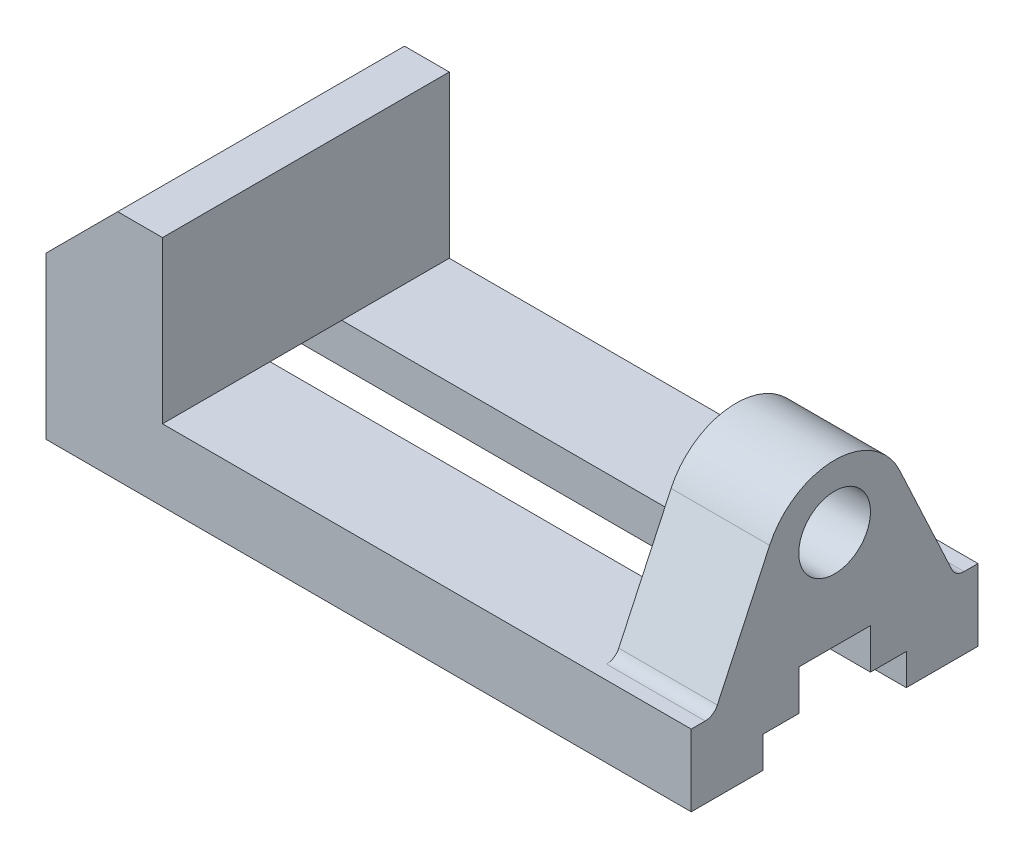
ISO-10303-21;
HEADER;
FILE_DESCRIPTION(('STEP AP214'),'2;1');
FILE_NAME('part.step','',(''),(''),'','','');
FILE_SCHEMA(('AUTOMOTIVE_DESIGN { 1 0 10303 214 1 1 1 1 }'));
ENDSEC;
DATA;
#1=APPLICATION_CONTEXT('core data for automotive mechanical design processes');
#2=APPLICATION_PROTOCOL_DEFINITION('international standard','automotive_design',2000,#1);
#3=PRODUCT_CONTEXT('',#1,'mechanical');
#4=PRODUCT('Part','Part','',(#3));
#5=PRODUCT_RELATED_PRODUCT_CATEGORY('part','',(#4));
#6=PRODUCT_DEFINITION_FORMATION('','',#4);
#7=PRODUCT_DEFINITION_CONTEXT('part definition',#1,'design');
#8=PRODUCT_DEFINITION('design','',#6,#7);
#9=PRODUCT_DEFINITION_SHAPE('','',#8);
#10=(LENGTH_UNIT() NAMED_UNIT(*) SI_UNIT(.MILLI.,.METRE.));
#11=(NAMED_UNIT(*) PLANE_ANGLE_UNIT() SI_UNIT($,.RADIAN.));
#12=(NAMED_UNIT(*) SI_UNIT($,.STERADIAN.) SOLID_ANGLE_UNIT());
#13=UNCERTAINTY_MEASURE_WITH_UNIT(LENGTH_MEASURE(1.E-05),#10,'distance_accuracy_value','');
#14=(GEOMETRIC_REPRESENTATION_CONTEXT(3) GLOBAL_UNCERTAINTY_ASSIGNED_CONTEXT((#13)) GLOBAL_UNIT_ASSIGNED_CONTEXT((#10,
#11,#12)) REPRESENTATION_CONTEXT('',''));
#15=CARTESIAN_POINT('',(0.,0.,0.));
#16=DIRECTION('',(0.,0.,1.));
#17=DIRECTION('',(1.,0.,0.));
#18=AXIS2_PLACEMENT_3D('',#15,#16,#17);
#19=CARTESIAN_POINT('',(144.,16.,64.));
#20=DIRECTION('',(-1.,0.,0.));
#21=DIRECTION('',(0.,0.,1.));
#22=AXIS2_PLACEMENT_3D('',#19,#20,#21);
#23=PLANE('',#22);
#24=CARTESIAN_POINT('',(144.,38.,32.));
#25=DIRECTION('',(1.,0.,0.));
#26=DIRECTION('',(0.,0.,-1.));
#27=AXIS2_PLACEMENT_3D('',#24,#25,#26);
#28=CIRCLE('',#27,8.);
#29=CARTESIAN_POINT('',(144.,38.,24.));
#30=VERTEX_POINT('',#29);
#31=EDGE_CURVE('E390',#30,#30,#28,.T.);
#32=ORIENTED_EDGE('',*,*,#31,.F.);
#33=EDGE_LOOP('',(#32));
#34=FACE_BOUND('',#33,.T.);
#35=DIRECTION('',(0.,1.,0.));
#36=VECTOR('',#35,1.);
#37=CARTESIAN_POINT('',(144.,0.,48.));
#38=LINE('',#37,#36);
#39=CARTESIAN_POINT('',(144.,0.,48.));
#40=VERTEX_POINT('',#39);
#41=CARTESIAN_POINT('',(144.,7.,48.));
#42=VERTEX_POINT('',#41);
#43=EDGE_CURVE('E291',#40,#42,#38,.T.);
#44=ORIENTED_EDGE('',*,*,#43,.T.);
#45=DIRECTION('',(0.,0.,-1.));
#46=VECTOR('',#45,1.);
#47=CARTESIAN_POINT('',(144.,7.,0.));
#48=LINE('',#47,#46);
#49=CARTESIAN_POINT('',(144.,7.,40.));
#50=VERTEX_POINT('',#49);
#51=EDGE_CURVE('E319',#42,#50,#48,.T.);
#52=ORIENTED_EDGE('',*,*,#51,.T.);
#53=DIRECTION('',(0.,1.,0.));
#54=VECTOR('',#53,1.);
#55=CARTESIAN_POINT('',(144.,0.,40.));
#56=LINE('',#55,#54);
#57=CARTESIAN_POINT('',(144.,16.,40.));
#58=VERTEX_POINT('',#57);
#59=EDGE_CURVE('E316',#50,#58,#56,.T.);
#60=ORIENTED_EDGE('',*,*,#59,.T.);
#61=DIRECTION('',(0.,0.,-1.));
#62=VECTOR('',#61,1.);
#63=CARTESIAN_POINT('',(144.,16.,0.));
#64=LINE('',#63,#62);
#65=CARTESIAN_POINT('',(144.,16.,24.));
#66=VERTEX_POINT('',#65);
#67=EDGE_CURVE('E313',#58,#66,#64,.T.);
#68=ORIENTED_EDGE('',*,*,#67,.T.);
#69=DIRECTION('',(0.,1.,0.));
#70=VECTOR('',#69,1.);
#71=CARTESIAN_POINT('',(144.,0.,24.));
#72=LINE('',#71,#70);
#73=CARTESIAN_POINT('',(144.,7.,24.));
#74=VERTEX_POINT('',#73);
#75=EDGE_CURVE('E310',#74,#66,#72,.T.);
#76=ORIENTED_EDGE('',*,*,#75,.F.);
#77=DIRECTION('',(0.,0.,1.));
#78=VECTOR('',#77,1.);
#79=CARTESIAN_POINT('',(144.,7.,0.));
#80=LINE('',#79,#78);
#81=CARTESIAN_POINT('',(144.,7.,16.));
#82=VERTEX_POINT('',#81);
#83=EDGE_CURVE('E307',#82,#74,#80,.T.);
#84=ORIENTED_EDGE('',*,*,#83,.F.);
#85=DIRECTION('',(0.,1.,0.));
#86=VECTOR('',#85,1.);
#87=CARTESIAN_POINT('',(144.,0.,16.));
#88=LINE('',#87,#86);
#89=CARTESIAN_POINT('',(144.,0.,16.));
#90=VERTEX_POINT('',#89);
#91=EDGE_CURVE('E287',#90,#82,#88,.T.);
#92=ORIENTED_EDGE('',*,*,#91,.F.);
#93=DIRECTION('',(0.,0.,-1.));
#94=VECTOR('',#93,1.);
#95=CARTESIAN_POINT('',(144.,0.,64.));
#96=LINE('',#95,#94);
#97=CARTESIAN_POINT('',(144.,0.,0.));
#98=VERTEX_POINT('',#97);
#99=EDGE_CURVE('E450',#90,#98,#96,.T.);
#100=ORIENTED_EDGE('',*,*,#99,.T.);
#101=DIRECTION('',(0.,1.,0.));
#102=VECTOR('',#101,1.);
#103=CARTESIAN_POINT('',(144.,16.,0.));
#104=LINE('',#103,#102);
#105=CARTESIAN_POINT('',(144.,16.,0.));
#106=VERTEX_POINT('',#105);
#107=EDGE_CURVE('E421',#98,#106,#104,.T.);
#108=ORIENTED_EDGE('',*,*,#107,.T.);
#109=DIRECTION('',(0.,0.,1.));
#110=VECTOR('',#109,1.);
#111=CARTESIAN_POINT('',(144.,16.,0.));
#112=LINE('',#111,#110);
#113=CARTESIAN_POINT('',(144.,16.,3.10858935107766));
#114=VERTEX_POINT('',#113);
#115=EDGE_CURVE('E384',#106,#114,#112,.T.);
#116=ORIENTED_EDGE('',*,*,#115,.T.);
#117=CARTESIAN_POINT('',(144.,19.,3.10858935107766));
#118=DIRECTION('',(1.,0.,0.));
#119=DIRECTION('',(0.,0.,-1.));
#120=AXIS2_PLACEMENT_3D('',#117,#118,#119);
#121=CIRCLE('',#120,3.);
#122=CARTESIAN_POINT('',(144.,17.7321452147779,5.82751271218761));
#123=VERTEX_POINT('',#122);
#124=EDGE_CURVE('E381',#123,#114,#121,.T.);
#125=ORIENTED_EDGE('',*,*,#124,.F.);
#126=DIRECTION('',(0.,-0.90630778703665,-0.4226182617407));
#127=VECTOR('',#126,1.);
#128=CARTESIAN_POINT('',(144.,0.935004123589847,-2.0051228137434));
#129=LINE('',#128,#127);
#130=CARTESIAN_POINT('',(144.,42.7618921878512,17.4990754074136));
#131=VERTEX_POINT('',#130);
#132=EDGE_CURVE('E364',#131,#123,#129,.T.);
#133=ORIENTED_EDGE('',*,*,#132,.F.);
#134=CARTESIAN_POINT('',(144.,36.,32.));
#135=DIRECTION('',(1.,0.,0.));
#136=DIRECTION('',(0.,0.,-1.));
#137=AXIS2_PLACEMENT_3D('',#134,#135,#136);
#138=CIRCLE('',#137,16.);
#139=CARTESIAN_POINT('',(144.,42.7618921878512,46.5009245925864));
#140=VERTEX_POINT('',#139);
#141=EDGE_CURVE('E373',#131,#140,#138,.T.);
#142=ORIENTED_EDGE('',*,*,#141,.T.);
#143=DIRECTION('',(0.,-0.90630778703665,0.4226182617407));
#144=VECTOR('',#143,1.);
#145=CARTESIAN_POINT('',(144.,25.4484263033972,54.5743263237126));
#146=LINE('',#145,#144);
#147=CARTESIAN_POINT('',(144.,17.7321452147779,58.1724872878124));
#148=VERTEX_POINT('',#147);
#149=EDGE_CURVE('E357',#140,#148,#146,.T.);
#150=ORIENTED_EDGE('',*,*,#149,.T.);
#151=CARTESIAN_POINT('',(144.,19.,60.8914106489223));
#152=DIRECTION('',(1.,0.,0.));
#153=DIRECTION('',(0.,0.,-1.));
#154=AXIS2_PLACEMENT_3D('',#151,#152,#153);
#155=CIRCLE('',#154,3.);
#156=CARTESIAN_POINT('',(144.,16.,60.8914106489224));
#157=VERTEX_POINT('',#156);
#158=EDGE_CURVE('E348',#148,#157,#155,.F.);
#159=ORIENTED_EDGE('',*,*,#158,.T.);
#160=DIRECTION('',(0.,0.,-1.));
#161=VECTOR('',#160,1.);
#162=CARTESIAN_POINT('',(144.,16.0000000000001,0.));
#163=LINE('',#162,#161);
#164=CARTESIAN_POINT('',(144.,16.,64.));
#165=VERTEX_POINT('',#164);
#166=EDGE_CURVE('E352',#165,#157,#163,.T.);
#167=ORIENTED_EDGE('',*,*,#166,.F.);
#168=DIRECTION('',(0.,1.,0.));
#169=VECTOR('',#168,1.);
#170=CARTESIAN_POINT('',(144.,0.,64.));
#171=LINE('',#170,#169);
#172=CARTESIAN_POINT('',(144.,0.,64.));
#173=VERTEX_POINT('',#172);
#174=EDGE_CURVE('E406',#173,#165,#171,.T.);
#175=ORIENTED_EDGE('',*,*,#174,.F.);
#176=EDGE_CURVE('E451',#173,#40,#96,.T.);
#177=ORIENTED_EDGE('',*,*,#176,.T.);
#178=EDGE_LOOP('',(#44,#52,#60,#68,#76,#84,#92,#100,#108,#116,#125,#133,#142,#150,#159,#167,
#175,#177));
#179=FACE_BOUND('',#178,.T.);
#180=ADVANCED_FACE('F78',(#34,#179),#23,.F.);
#181=CARTESIAN_POINT('',(0.,0.,64.));
#182=DIRECTION('',(0.,1.,0.));
#183=DIRECTION('',(0.,0.,1.));
#184=AXIS2_PLACEMENT_3D('',#181,#182,#183);
#185=PLANE('',#184);
#186=CARTESIAN_POINT('',(36.,0.,54.));
#187=DIRECTION('',(0.,-1.,0.));
#188=DIRECTION('',(0.,0.,-1.));
#189=AXIS2_PLACEMENT_3D('',#186,#187,#188);
#190=CIRCLE('',#189,2.525);
#191=CARTESIAN_POINT('',(36.,0.,51.475));
#192=VERTEX_POINT('',#191);
#193=EDGE_CURVE('E260',#192,#192,#190,.T.);
#194=ORIENTED_EDGE('',*,*,#193,.F.);
#195=EDGE_LOOP('',(#194));
#196=FACE_BOUND('',#195,.T.);
#197=CARTESIAN_POINT('',(106.,0.,54.));
#198=DIRECTION('',(0.,-1.,0.));
#199=DIRECTION('',(0.,0.,-1.));
#200=AXIS2_PLACEMENT_3D('',#197,#198,#199);
#201=CIRCLE('',#200,2.525);
#202=CARTESIAN_POINT('',(106.,0.,51.475));
#203=VERTEX_POINT('',#202);
#204=EDGE_CURVE('E253',#203,#203,#201,.T.);
#205=ORIENTED_EDGE('',*,*,#204,.F.);
#206=EDGE_LOOP('',(#205));
#207=FACE_BOUND('',#206,.T.);
#208=DIRECTION('',(1.,0.,0.));
#209=VECTOR('',#208,1.);
#210=CARTESIAN_POINT('',(0.,0.,48.));
#211=LINE('',#210,#209);
#212=CARTESIAN_POINT('',(0.,0.,48.));
#213=VERTEX_POINT('',#212);
#214=EDGE_CURVE('E324',#213,#40,#211,.T.);
#215=ORIENTED_EDGE('',*,*,#214,.T.);
#216=ORIENTED_EDGE('',*,*,#176,.F.);
#217=DIRECTION('',(1.,0.,0.));
#218=VECTOR('',#217,1.);
#219=CARTESIAN_POINT('',(0.,0.,64.));
#220=LINE('',#219,#218);
#221=CARTESIAN_POINT('',(0.,0.,64.));
#222=VERTEX_POINT('',#221);
#223=EDGE_CURVE('E403',#222,#173,#220,.T.);
#224=ORIENTED_EDGE('',*,*,#223,.F.);
#225=DIRECTION('',(0.,0.,-1.));
#226=VECTOR('',#225,1.);
#227=CARTESIAN_POINT('',(0.,0.,64.));
#228=LINE('',#227,#226);
#229=EDGE_CURVE('E12',#222,#213,#228,.T.);
#230=ORIENTED_EDGE('',*,*,#229,.T.);
#231=EDGE_LOOP('',(#215,#216,#224,#230));
#232=FACE_BOUND('',#231,.T.);
#233=ADVANCED_FACE('F525',(#196,#207,#232),#185,.F.);
#234=CARTESIAN_POINT('',(26.,16.,64.));
#235=DIRECTION('',(0.,-1.,0.));
#236=DIRECTION('',(0.,0.,-1.));
#237=AXIS2_PLACEMENT_3D('',#234,#235,#236);
#238=PLANE('',#237);
#239=DIRECTION('',(1.,0.,0.));
#240=VECTOR('',#239,1.);
#241=CARTESIAN_POINT('',(0.,16.,40.));
#242=LINE('',#241,#240);
#243=CARTESIAN_POINT('',(26.,16.,40.));
#244=VERTEX_POINT('',#243);
#245=CARTESIAN_POINT('',(122.,16.,40.));
#246=VERTEX_POINT('',#245);
#247=EDGE_CURVE('E335',#244,#246,#242,.T.);
#248=ORIENTED_EDGE('',*,*,#247,.F.);
#249=DIRECTION('',(0.,0.,-1.));
#250=VECTOR('',#249,1.);
#251=CARTESIAN_POINT('',(26.,16.,64.));
#252=LINE('',#251,#250);
#253=CARTESIAN_POINT('',(26.,16.,64.));
#254=VERTEX_POINT('',#253);
#255=EDGE_CURVE('E444',#254,#244,#252,.T.);
#256=ORIENTED_EDGE('',*,*,#255,.F.);
#257=DIRECTION('',(-1.,0.,0.));
#258=VECTOR('',#257,1.);
#259=CARTESIAN_POINT('',(26.,16.,64.));
#260=LINE('',#259,#258);
#261=EDGE_CURVE('E409',#165,#254,#260,.T.);
#262=ORIENTED_EDGE('',*,*,#261,.F.);
#263=ORIENTED_EDGE('',*,*,#166,.T.);
#264=DIRECTION('',(1.,0.,0.));
#265=VECTOR('',#264,1.);
#266=CARTESIAN_POINT('',(122.,16.,60.8914106489224));
#267=LINE('',#266,#265);
#268=CARTESIAN_POINT('',(122.,16.,60.8914106489224));
#269=VERTEX_POINT('',#268);
#270=EDGE_CURVE('E362',#269,#157,#267,.T.);
#271=ORIENTED_EDGE('',*,*,#270,.F.);
#272=DIRECTION('',(0.,0.,-1.));
#273=VECTOR('',#272,1.);
#274=CARTESIAN_POINT('',(122.,16.,64.));
#275=LINE('',#274,#273);
#276=EDGE_CURVE('E448',#269,#246,#275,.T.);
#277=ORIENTED_EDGE('',*,*,#276,.T.);
#278=EDGE_LOOP('',(#248,#256,#262,#263,#271,#277));
#279=FACE_BOUND('',#278,.T.);
#280=ADVANCED_FACE('F519',(#279),#238,.F.);
#281=CARTESIAN_POINT('',(0.,16.,64.));
#282=DIRECTION('',(1.,0.,0.));
#283=DIRECTION('',(0.,0.,-1.));
#284=AXIS2_PLACEMENT_3D('',#281,#282,#283);
#285=PLANE('',#284);
#286=DIRECTION('',(0.,1.,0.));
#287=VECTOR('',#286,1.);
#288=CARTESIAN_POINT('',(0.,0.,48.));
#289=LINE('',#288,#287);
#290=CARTESIAN_POINT('',(0.,7.,48.));
#291=VERTEX_POINT('',#290);
#292=EDGE_CURVE('E302',#213,#291,#289,.T.);
#293=ORIENTED_EDGE('',*,*,#292,.F.);
#294=ORIENTED_EDGE('',*,*,#229,.F.);
#295=DIRECTION('',(0.,-1.,0.));
#296=VECTOR('',#295,1.);
#297=CARTESIAN_POINT('',(0.,0.,64.));
#298=LINE('',#297,#296);
#299=CARTESIAN_POINT('',(0.,35.9999999999997,64.));
#300=VERTEX_POINT('',#299);
#301=EDGE_CURVE('E400',#300,#222,#298,.T.);
#302=ORIENTED_EDGE('',*,*,#301,.F.);
#303=DIRECTION('',(0.,0.,-1.));
#304=VECTOR('',#303,1.);
#305=CARTESIAN_POINT('',(0.,35.9999999999997,64.));
#306=LINE('',#305,#304);
#307=CARTESIAN_POINT('',(0.,35.9999999999997,0.));
#308=VERTEX_POINT('',#307);
#309=EDGE_CURVE('E418',#300,#308,#306,.T.);
#310=ORIENTED_EDGE('',*,*,#309,.T.);
#311=DIRECTION('',(0.,-1.,0.));
#312=VECTOR('',#311,1.);
#313=CARTESIAN_POINT('',(0.,16.,0.));
#314=LINE('',#313,#312);
#315=CARTESIAN_POINT('',(0.,0.,0.));
#316=VERTEX_POINT('',#315);
#317=EDGE_CURVE('E404',#308,#316,#314,.T.);
#318=ORIENTED_EDGE('',*,*,#317,.T.);
#319=CARTESIAN_POINT('',(0.,0.,16.));
#320=VERTEX_POINT('',#319);
#321=EDGE_CURVE('E86',#320,#316,#228,.T.);
#322=ORIENTED_EDGE('',*,*,#321,.F.);
#323=DIRECTION('',(0.,1.,0.));
#324=VECTOR('',#323,1.);
#325=CARTESIAN_POINT('',(0.,0.,16.));
#326=LINE('',#325,#324);
#327=CARTESIAN_POINT('',(0.,7.,16.));
#328=VERTEX_POINT('',#327);
#329=EDGE_CURVE('E288',#320,#328,#326,.T.);
#330=ORIENTED_EDGE('',*,*,#329,.T.);
#331=DIRECTION('',(0.,0.,1.));
#332=VECTOR('',#331,1.);
#333=CARTESIAN_POINT('',(0.,7.,0.));
#334=LINE('',#333,#332);
#335=CARTESIAN_POINT('',(0.,7.,24.));
#336=VERTEX_POINT('',#335);
#337=EDGE_CURVE('E101',#328,#336,#334,.T.);
#338=ORIENTED_EDGE('',*,*,#337,.T.);
#339=DIRECTION('',(0.,1.,0.));
#340=VECTOR('',#339,1.);
#341=CARTESIAN_POINT('',(0.,0.,24.));
#342=LINE('',#341,#340);
#343=CARTESIAN_POINT('',(0.,16.,24.));
#344=VERTEX_POINT('',#343);
#345=EDGE_CURVE('E293',#336,#344,#342,.T.);
#346=ORIENTED_EDGE('',*,*,#345,.T.);
#347=DIRECTION('',(0.,0.,-1.));
#348=VECTOR('',#347,1.);
#349=CARTESIAN_POINT('',(0.,16.,0.));
#350=LINE('',#349,#348);
#351=CARTESIAN_POINT('',(0.,16.,40.));
#352=VERTEX_POINT('',#351);
#353=EDGE_CURVE('E296',#352,#344,#350,.T.);
#354=ORIENTED_EDGE('',*,*,#353,.F.);
#355=DIRECTION('',(0.,1.,0.));
#356=VECTOR('',#355,1.);
#357=CARTESIAN_POINT('',(0.,0.,40.));
#358=LINE('',#357,#356);
#359=CARTESIAN_POINT('',(0.,7.,40.));
#360=VERTEX_POINT('',#359);
#361=EDGE_CURVE('E298',#360,#352,#358,.T.);
#362=ORIENTED_EDGE('',*,*,#361,.F.);
#363=DIRECTION('',(0.,0.,-1.));
#364=VECTOR('',#363,1.);
#365=CARTESIAN_POINT('',(0.,7.,0.));
#366=LINE('',#365,#364);
#367=EDGE_CURVE('E300',#291,#360,#366,.T.);
#368=ORIENTED_EDGE('',*,*,#367,.F.);
#369=EDGE_LOOP('',(#293,#294,#302,#310,#318,#322,#330,#338,#346,#354,#362,#368));
#370=FACE_BOUND('',#369,.T.);
#371=ADVANCED_FACE('F471',(#370),#285,.F.);
#372=CARTESIAN_POINT('',(122.,16.,64.));
#373=DIRECTION('',(1.,0.,0.));
#374=DIRECTION('',(0.,0.,-1.));
#375=AXIS2_PLACEMENT_3D('',#372,#373,#374);
#376=PLANE('',#375);
#377=CARTESIAN_POINT('',(122.,38.,32.));
#378=DIRECTION('',(1.,0.,0.));
#379=DIRECTION('',(0.,0.,-1.));
#380=AXIS2_PLACEMENT_3D('',#377,#378,#379);
#381=CIRCLE('',#380,8.);
#382=CARTESIAN_POINT('',(122.,38.,24.));
#383=VERTEX_POINT('',#382);
#384=EDGE_CURVE('E394',#383,#383,#381,.T.);
#385=ORIENTED_EDGE('',*,*,#384,.T.);
#386=EDGE_LOOP('',(#385));
#387=FACE_BOUND('',#386,.T.);
#388=CARTESIAN_POINT('',(122.,19.,60.8914106489223));
#389=DIRECTION('',(1.,0.,0.));
#390=DIRECTION('',(0.,0.,-1.));
#391=AXIS2_PLACEMENT_3D('',#388,#389,#390);
#392=CIRCLE('',#391,3.);
#393=CARTESIAN_POINT('',(122.,17.7321452147779,58.1724872878124));
#394=VERTEX_POINT('',#393);
#395=EDGE_CURVE('E349',#394,#269,#392,.F.);
#396=ORIENTED_EDGE('',*,*,#395,.F.);
#397=DIRECTION('',(0.,-0.90630778703665,0.4226182617407));
#398=VECTOR('',#397,1.);
#399=CARTESIAN_POINT('',(122.,25.4484263033972,54.5743263237126));
#400=LINE('',#399,#398);
#401=CARTESIAN_POINT('',(122.,42.7618921878512,46.5009245925864));
#402=VERTEX_POINT('',#401);
#403=EDGE_CURVE('E351',#402,#394,#400,.T.);
#404=ORIENTED_EDGE('',*,*,#403,.F.);
#405=CARTESIAN_POINT('',(122.,36.,32.));
#406=DIRECTION('',(1.,0.,0.));
#407=DIRECTION('',(0.,0.,-1.));
#408=AXIS2_PLACEMENT_3D('',#405,#406,#407);
#409=CIRCLE('',#408,16.);
#410=CARTESIAN_POINT('',(122.,42.7618921878512,17.4990754074136));
#411=VERTEX_POINT('',#410);
#412=EDGE_CURVE('E376',#411,#402,#409,.T.);
#413=ORIENTED_EDGE('',*,*,#412,.F.);
#414=DIRECTION('',(0.,-0.90630778703665,-0.4226182617407));
#415=VECTOR('',#414,1.);
#416=CARTESIAN_POINT('',(122.,0.935004123589847,-2.0051228137434));
#417=LINE('',#416,#415);
#418=CARTESIAN_POINT('',(122.,17.7321452147779,5.82751271218761));
#419=VERTEX_POINT('',#418);
#420=EDGE_CURVE('E369',#411,#419,#417,.T.);
#421=ORIENTED_EDGE('',*,*,#420,.T.);
#422=CARTESIAN_POINT('',(122.,19.,3.10858935107766));
#423=DIRECTION('',(1.,0.,0.));
#424=DIRECTION('',(0.,0.,-1.));
#425=AXIS2_PLACEMENT_3D('',#422,#423,#424);
#426=CIRCLE('',#425,3.);
#427=CARTESIAN_POINT('',(122.,16.,3.10858935107766));
#428=VERTEX_POINT('',#427);
#429=EDGE_CURVE('E372',#419,#428,#426,.T.);
#430=ORIENTED_EDGE('',*,*,#429,.T.);
#431=CARTESIAN_POINT('',(122.,16.,24.));
#432=VERTEX_POINT('',#431);
#433=EDGE_CURVE('E447',#432,#428,#275,.T.);
#434=ORIENTED_EDGE('',*,*,#433,.F.);
#435=DIRECTION('',(0.,0.,-1.));
#436=VECTOR('',#435,1.);
#437=CARTESIAN_POINT('',(122.,16.,64.));
#438=LINE('',#437,#436);
#439=EDGE_CURVE('E346',#246,#432,#438,.T.);
#440=ORIENTED_EDGE('',*,*,#439,.F.);
#441=ORIENTED_EDGE('',*,*,#276,.F.);
#442=EDGE_LOOP('',(#396,#404,#413,#421,#430,#434,#440,#441));
#443=FACE_BOUND('',#442,.T.);
#444=ADVANCED_FACE('F556',(#387,#443),#376,.F.);
#445=CARTESIAN_POINT('',(0.,0.,0.));
#446=DIRECTION('',(0.,0.,1.));
#447=DIRECTION('',(1.,0.,0.));
#448=AXIS2_PLACEMENT_3D('',#445,#446,#447);
#449=PLANE('',#448);
#450=DIRECTION('',(-1.,0.,0.));
#451=VECTOR('',#450,1.);
#452=CARTESIAN_POINT('',(26.,16.,0.));
#453=LINE('',#452,#451);
#454=CARTESIAN_POINT('',(26.,16.,0.));
#455=VERTEX_POINT('',#454);
#456=EDGE_CURVE('E424',#106,#455,#453,.T.);
#457=ORIENTED_EDGE('',*,*,#456,.F.);
#458=ORIENTED_EDGE('',*,*,#107,.F.);
#459=DIRECTION('',(1.,0.,0.));
#460=VECTOR('',#459,1.);
#461=CARTESIAN_POINT('',(0.,0.,0.));
#462=LINE('',#461,#460);
#463=EDGE_CURVE('E397',#316,#98,#462,.T.);
#464=ORIENTED_EDGE('',*,*,#463,.F.);
#465=ORIENTED_EDGE('',*,*,#317,.F.);
#466=DIRECTION('',(-0.707106781186541,-0.707106781186554,0.));
#467=VECTOR('',#466,1.);
#468=CARTESIAN_POINT('',(15.9999999999999,52.,0.));
#469=LINE('',#468,#467);
#470=CARTESIAN_POINT('',(15.9999999999999,52.,0.));
#471=VERTEX_POINT('',#470);
#472=EDGE_CURVE('E431',#471,#308,#469,.T.);
#473=ORIENTED_EDGE('',*,*,#472,.F.);
#474=DIRECTION('',(-1.,0.,0.));
#475=VECTOR('',#474,1.);
#476=CARTESIAN_POINT('',(25.9999999999999,52.,0.));
#477=LINE('',#476,#475);
#478=CARTESIAN_POINT('',(25.9999999999999,52.,0.));
#479=VERTEX_POINT('',#478);
#480=EDGE_CURVE('E429',#479,#471,#477,.T.);
#481=ORIENTED_EDGE('',*,*,#480,.F.);
#482=DIRECTION('',(0.,1.,0.));
#483=VECTOR('',#482,1.);
#484=CARTESIAN_POINT('',(25.9999999999999,52.,0.));
#485=LINE('',#484,#483);
#486=EDGE_CURVE('E427',#455,#479,#485,.T.);
#487=ORIENTED_EDGE('',*,*,#486,.F.);
#488=EDGE_LOOP('',(#457,#458,#464,#465,#473,#481,#487));
#489=FACE_BOUND('',#488,.T.);
#490=ADVANCED_FACE('F464',(#489),#449,.F.);
#491=CARTESIAN_POINT('',(106.,0.,10.));
#492=DIRECTION('',(0.,-1.,0.));
#493=DIRECTION('',(0.,0.,-1.));
#494=AXIS2_PLACEMENT_3D('',#491,#492,#493);
#495=CIRCLE('',#494,2.525);
#496=CARTESIAN_POINT('',(106.,0.,7.47500000000003));
#497=VERTEX_POINT('',#496);
#498=EDGE_CURVE('E269',#497,#497,#495,.T.);
#499=ORIENTED_EDGE('',*,*,#498,.F.);
#500=EDGE_LOOP('',(#499));
#501=FACE_BOUND('',#500,.T.);
#502=CARTESIAN_POINT('',(36.,0.,10.));
#503=DIRECTION('',(0.,-1.,0.));
#504=DIRECTION('',(0.,0.,-1.));
#505=AXIS2_PLACEMENT_3D('',#502,#503,#504);
#506=CIRCLE('',#505,2.525);
#507=CARTESIAN_POINT('',(36.,0.,7.47500000000003));
#508=VERTEX_POINT('',#507);
#509=EDGE_CURVE('E278',#508,#508,#506,.T.);
#510=ORIENTED_EDGE('',*,*,#509,.F.);
#511=EDGE_LOOP('',(#510));
#512=FACE_BOUND('',#511,.T.);
#513=ORIENTED_EDGE('',*,*,#99,.F.);
#514=DIRECTION('',(1.,0.,0.));
#515=VECTOR('',#514,1.);
#516=CARTESIAN_POINT('',(0.,0.,16.));
#517=LINE('',#516,#515);
#518=EDGE_CURVE('E304',#320,#90,#517,.T.);
#519=ORIENTED_EDGE('',*,*,#518,.F.);
#520=ORIENTED_EDGE('',*,*,#321,.T.);
#521=ORIENTED_EDGE('',*,*,#463,.T.);
#522=EDGE_LOOP('',(#513,#519,#520,#521));
#523=FACE_BOUND('',#522,.T.);
#524=ADVANCED_FACE('F80',(#501,#512,#523),#185,.F.);
#525=CARTESIAN_POINT('',(26.,16.,24.));
#526=VERTEX_POINT('',#525);
#527=EDGE_CURVE('E443',#526,#455,#252,.T.);
#528=ORIENTED_EDGE('',*,*,#527,.F.);
#529=DIRECTION('',(1.,0.,0.));
#530=VECTOR('',#529,1.);
#531=CARTESIAN_POINT('',(0.,16.,24.));
#532=LINE('',#531,#530);
#533=EDGE_CURVE('E338',#526,#432,#532,.T.);
#534=ORIENTED_EDGE('',*,*,#533,.T.);
#535=ORIENTED_EDGE('',*,*,#433,.T.);
#536=DIRECTION('',(1.,0.,0.));
#537=VECTOR('',#536,1.);
#538=CARTESIAN_POINT('',(122.,16.,3.10858935107766));
#539=LINE('',#538,#537);
#540=EDGE_CURVE('E391',#428,#114,#539,.T.);
#541=ORIENTED_EDGE('',*,*,#540,.T.);
#542=ORIENTED_EDGE('',*,*,#115,.F.);
#543=ORIENTED_EDGE('',*,*,#456,.T.);
#544=EDGE_LOOP('',(#528,#534,#535,#541,#542,#543));
#545=FACE_BOUND('',#544,.T.);
#546=ADVANCED_FACE('F490',(#545),#238,.F.);
#547=CARTESIAN_POINT('',(25.9999999999999,52.,64.));
#548=DIRECTION('',(-1.,0.,0.));
#549=DIRECTION('',(0.,-1.,0.));
#550=AXIS2_PLACEMENT_3D('',#547,#548,#549);
#551=PLANE('',#550);
#552=ORIENTED_EDGE('',*,*,#486,.T.);
#553=DIRECTION('',(0.,0.,-1.));
#554=VECTOR('',#553,1.);
#555=CARTESIAN_POINT('',(25.9999999999999,52.,64.));
#556=LINE('',#555,#554);
#557=CARTESIAN_POINT('',(25.9999999999999,52.,64.));
#558=VERTEX_POINT('',#557);
#559=EDGE_CURVE('E440',#558,#479,#556,.T.);
#560=ORIENTED_EDGE('',*,*,#559,.F.);
#561=DIRECTION('',(0.,1.,0.));
#562=VECTOR('',#561,1.);
#563=CARTESIAN_POINT('',(25.9999999999999,52.,64.));
#564=LINE('',#563,#562);
#565=EDGE_CURVE('E411',#254,#558,#564,.T.);
#566=ORIENTED_EDGE('',*,*,#565,.F.);
#567=ORIENTED_EDGE('',*,*,#255,.T.);
#568=DIRECTION('',(0.,0.,1.));
#569=VECTOR('',#568,1.);
#570=CARTESIAN_POINT('',(26.,16.,64.));
#571=LINE('',#570,#569);
#572=EDGE_CURVE('E327',#526,#244,#571,.T.);
#573=ORIENTED_EDGE('',*,*,#572,.F.);
#574=ORIENTED_EDGE('',*,*,#527,.T.);
#575=EDGE_LOOP('',(#552,#560,#566,#567,#573,#574));
#576=FACE_BOUND('',#575,.T.);
#577=ADVANCED_FACE('F485',(#576),#551,.F.);
#578=CARTESIAN_POINT('',(25.9999999999999,52.,64.));
#579=DIRECTION('',(0.,-1.,0.));
#580=DIRECTION('',(1.,0.,0.));
#581=AXIS2_PLACEMENT_3D('',#578,#579,#580);
#582=PLANE('',#581);
#583=ORIENTED_EDGE('',*,*,#480,.T.);
#584=DIRECTION('',(0.,0.,-1.));
#585=VECTOR('',#584,1.);
#586=CARTESIAN_POINT('',(15.9999999999999,52.,64.));
#587=LINE('',#586,#585);
#588=CARTESIAN_POINT('',(15.9999999999999,52.,64.));
#589=VERTEX_POINT('',#588);
#590=EDGE_CURVE('E437',#589,#471,#587,.T.);
#591=ORIENTED_EDGE('',*,*,#590,.F.);
#592=DIRECTION('',(-1.,0.,0.));
#593=VECTOR('',#592,1.);
#594=CARTESIAN_POINT('',(25.9999999999999,52.,64.));
#595=LINE('',#594,#593);
#596=EDGE_CURVE('E413',#558,#589,#595,.T.);
#597=ORIENTED_EDGE('',*,*,#596,.F.);
#598=ORIENTED_EDGE('',*,*,#559,.T.);
#599=EDGE_LOOP('',(#583,#591,#597,#598));
#600=FACE_BOUND('',#599,.T.);
#601=ADVANCED_FACE('F481',(#600),#582,.F.);
#602=CARTESIAN_POINT('',(15.9999999999999,52.,64.));
#603=DIRECTION('',(0.707106781186554,-0.707106781186541,0.));
#604=DIRECTION('',(0.707106781186541,0.707106781186554,0.));
#605=AXIS2_PLACEMENT_3D('',#602,#603,#604);
#606=PLANE('',#605);
#607=ORIENTED_EDGE('',*,*,#472,.T.);
#608=ORIENTED_EDGE('',*,*,#309,.F.);
#609=DIRECTION('',(-0.707106781186541,-0.707106781186554,0.));
#610=VECTOR('',#609,1.);
#611=CARTESIAN_POINT('',(15.9999999999999,52.,64.));
#612=LINE('',#611,#610);
#613=EDGE_CURVE('E415',#589,#300,#612,.T.);
#614=ORIENTED_EDGE('',*,*,#613,.F.);
#615=ORIENTED_EDGE('',*,*,#590,.T.);
#616=EDGE_LOOP('',(#607,#608,#614,#615));
#617=FACE_BOUND('',#616,.T.);
#618=ADVANCED_FACE('F476',(#617),#606,.F.);
#619=CARTESIAN_POINT('',(0.,0.,64.));
#620=DIRECTION('',(0.,0.,1.));
#621=DIRECTION('',(1.,0.,0.));
#622=AXIS2_PLACEMENT_3D('',#619,#620,#621);
#623=PLANE('',#622);
#624=ORIENTED_EDGE('',*,*,#174,.T.);
#625=ORIENTED_EDGE('',*,*,#261,.T.);
#626=ORIENTED_EDGE('',*,*,#565,.T.);
#627=ORIENTED_EDGE('',*,*,#596,.T.);
#628=ORIENTED_EDGE('',*,*,#613,.T.);
#629=ORIENTED_EDGE('',*,*,#301,.T.);
#630=ORIENTED_EDGE('',*,*,#223,.T.);
#631=EDGE_LOOP('',(#624,#625,#626,#627,#628,#629,#630));
#632=FACE_BOUND('',#631,.T.);
#633=ADVANCED_FACE('F522',(#632),#623,.T.);
#634=CARTESIAN_POINT('',(122.,0.935004123589847,-2.0051228137434));
#635=DIRECTION('',(0.,-0.4226182617407,0.90630778703665));
#636=DIRECTION('',(0.,-0.90630778703665,-0.4226182617407));
#637=AXIS2_PLACEMENT_3D('',#634,#635,#636);
#638=PLANE('',#637);
#639=ORIENTED_EDGE('',*,*,#132,.T.);
#640=DIRECTION('',(1.,0.,0.));
#641=VECTOR('',#640,1.);
#642=CARTESIAN_POINT('',(122.,17.7321452147779,5.82751271218761));
#643=LINE('',#642,#641);
#644=EDGE_CURVE('E378',#419,#123,#643,.T.);
#645=ORIENTED_EDGE('',*,*,#644,.F.);
#646=ORIENTED_EDGE('',*,*,#420,.F.);
#647=DIRECTION('',(1.,0.,0.));
#648=VECTOR('',#647,1.);
#649=CARTESIAN_POINT('',(122.,42.7618921878512,17.4990754074136));
#650=LINE('',#649,#648);
#651=EDGE_CURVE('E388',#411,#131,#650,.T.);
#652=ORIENTED_EDGE('',*,*,#651,.T.);
#653=EDGE_LOOP('',(#639,#645,#646,#652));
#654=FACE_BOUND('',#653,.T.);
#655=ADVANCED_FACE('F499',(#654),#638,.F.);
#656=CARTESIAN_POINT('',(122.,36.,32.));
#657=DIRECTION('',(1.,0.,0.));
#658=DIRECTION('',(0.,0.,-1.));
#659=AXIS2_PLACEMENT_3D('',#656,#657,#658);
#660=CYLINDRICAL_SURFACE('',#659,16.);
#661=ORIENTED_EDGE('',*,*,#141,.F.);
#662=ORIENTED_EDGE('',*,*,#651,.F.);
#663=ORIENTED_EDGE('',*,*,#412,.T.);
#664=DIRECTION('',(1.,0.,0.));
#665=VECTOR('',#664,1.);
#666=CARTESIAN_POINT('',(122.,42.7618921878512,46.5009245925864));
#667=LINE('',#666,#665);
#668=EDGE_CURVE('E365',#402,#140,#667,.T.);
#669=ORIENTED_EDGE('',*,*,#668,.T.);
#670=EDGE_LOOP('',(#661,#662,#663,#669));
#671=FACE_BOUND('',#670,.T.);
#672=ADVANCED_FACE('F503',(#671),#660,.T.);
#673=CARTESIAN_POINT('',(122.,19.,3.10858935107766));
#674=DIRECTION('',(1.,0.,0.));
#675=DIRECTION('',(0.,0.,-1.));
#676=AXIS2_PLACEMENT_3D('',#673,#674,#675);
#677=CYLINDRICAL_SURFACE('',#676,3.);
#678=ORIENTED_EDGE('',*,*,#124,.T.);
#679=ORIENTED_EDGE('',*,*,#540,.F.);
#680=ORIENTED_EDGE('',*,*,#429,.F.);
#681=ORIENTED_EDGE('',*,*,#644,.T.);
#682=EDGE_LOOP('',(#678,#679,#680,#681));
#683=FACE_BOUND('',#682,.T.);
#684=ADVANCED_FACE('F495',(#683),#677,.F.);
#685=CARTESIAN_POINT('',(122.,38.,32.));
#686=DIRECTION('',(1.,0.,0.));
#687=DIRECTION('',(0.,0.,-1.));
#688=AXIS2_PLACEMENT_3D('',#685,#686,#687);
#689=CYLINDRICAL_SURFACE('',#688,8.);
#690=ORIENTED_EDGE('',*,*,#384,.F.);
#691=EDGE_LOOP('',(#690));
#692=FACE_BOUND('',#691,.T.);
#693=ORIENTED_EDGE('',*,*,#31,.T.);
#694=EDGE_LOOP('',(#693));
#695=FACE_BOUND('',#694,.T.);
#696=ADVANCED_FACE('F575',(#692,#695),#689,.F.);
#697=CARTESIAN_POINT('',(122.,19.,60.8914106489223));
#698=DIRECTION('',(1.,0.,0.));
#699=DIRECTION('',(0.,0.,-1.));
#700=AXIS2_PLACEMENT_3D('',#697,#698,#699);
#701=CYLINDRICAL_SURFACE('',#700,3.);
#702=ORIENTED_EDGE('',*,*,#158,.F.);
#703=DIRECTION('',(1.,0.,0.));
#704=VECTOR('',#703,1.);
#705=CARTESIAN_POINT('',(122.,17.7321452147779,58.1724872878124));
#706=LINE('',#705,#704);
#707=EDGE_CURVE('E354',#394,#148,#706,.T.);
#708=ORIENTED_EDGE('',*,*,#707,.F.);
#709=ORIENTED_EDGE('',*,*,#395,.T.);
#710=ORIENTED_EDGE('',*,*,#270,.T.);
#711=EDGE_LOOP('',(#702,#708,#709,#710));
#712=FACE_BOUND('',#711,.T.);
#713=ADVANCED_FACE('F514',(#712),#701,.F.);
#714=CARTESIAN_POINT('',(122.,25.4484263033972,54.5743263237126));
#715=DIRECTION('',(0.,0.4226182617407,0.90630778703665));
#716=DIRECTION('',(0.,-0.90630778703665,0.4226182617407));
#717=AXIS2_PLACEMENT_3D('',#714,#715,#716);
#718=PLANE('',#717);
#719=ORIENTED_EDGE('',*,*,#149,.F.);
#720=ORIENTED_EDGE('',*,*,#668,.F.);
#721=ORIENTED_EDGE('',*,*,#403,.T.);
#722=ORIENTED_EDGE('',*,*,#707,.T.);
#723=EDGE_LOOP('',(#719,#720,#721,#722));
#724=FACE_BOUND('',#723,.T.);
#725=ADVANCED_FACE('F509',(#724),#718,.T.);
#726=CARTESIAN_POINT('',(0.,16.,0.));
#727=DIRECTION('',(0.,-1.,0.));
#728=DIRECTION('',(0.,0.,-1.));
#729=AXIS2_PLACEMENT_3D('',#726,#727,#728);
#730=PLANE('',#729);
#731=ORIENTED_EDGE('',*,*,#439,.T.);
#732=EDGE_CURVE('E339',#432,#66,#532,.T.);
#733=ORIENTED_EDGE('',*,*,#732,.T.);
#734=ORIENTED_EDGE('',*,*,#67,.F.);
#735=EDGE_CURVE('E336',#246,#58,#242,.T.);
#736=ORIENTED_EDGE('',*,*,#735,.F.);
#737=EDGE_LOOP('',(#731,#733,#734,#736));
#738=FACE_BOUND('',#737,.T.);
#739=ADVANCED_FACE('F544',(#738),#730,.T.);
#740=ORIENTED_EDGE('',*,*,#572,.T.);
#741=EDGE_CURVE('E332',#352,#244,#242,.T.);
#742=ORIENTED_EDGE('',*,*,#741,.F.);
#743=ORIENTED_EDGE('',*,*,#353,.T.);
#744=EDGE_CURVE('E93',#344,#526,#532,.T.);
#745=ORIENTED_EDGE('',*,*,#744,.T.);
#746=EDGE_LOOP('',(#740,#742,#743,#745));
#747=FACE_BOUND('',#746,.T.);
#748=ADVANCED_FACE('F553',(#747),#730,.T.);
#749=CARTESIAN_POINT('',(0.,0.,48.));
#750=DIRECTION('',(0.,0.,-1.));
#751=DIRECTION('',(-1.,0.,0.));
#752=AXIS2_PLACEMENT_3D('',#749,#750,#751);
#753=PLANE('',#752);
#754=ORIENTED_EDGE('',*,*,#43,.F.);
#755=ORIENTED_EDGE('',*,*,#214,.F.);
#756=ORIENTED_EDGE('',*,*,#292,.T.);
#757=DIRECTION('',(1.,0.,0.));
#758=VECTOR('',#757,1.);
#759=CARTESIAN_POINT('',(0.,7.,48.));
#760=LINE('',#759,#758);
#761=EDGE_CURVE('E328',#291,#42,#760,.T.);
#762=ORIENTED_EDGE('',*,*,#761,.T.);
#763=EDGE_LOOP('',(#754,#755,#756,#762));
#764=FACE_BOUND('',#763,.T.);
#765=ADVANCED_FACE('F527',(#764),#753,.T.);
#766=CARTESIAN_POINT('',(0.,7.,0.));
#767=DIRECTION('',(0.,-1.,0.));
#768=DIRECTION('',(0.,0.,-1.));
#769=AXIS2_PLACEMENT_3D('',#766,#767,#768);
#770=PLANE('',#769);
#771=ORIENTED_EDGE('',*,*,#51,.F.);
#772=ORIENTED_EDGE('',*,*,#761,.F.);
#773=ORIENTED_EDGE('',*,*,#367,.T.);
#774=DIRECTION('',(1.,0.,0.));
#775=VECTOR('',#774,1.);
#776=CARTESIAN_POINT('',(0.,7.,40.));
#777=LINE('',#776,#775);
#778=EDGE_CURVE('E330',#360,#50,#777,.T.);
#779=ORIENTED_EDGE('',*,*,#778,.T.);
#780=EDGE_LOOP('',(#771,#772,#773,#779));
#781=FACE_BOUND('',#780,.T.);
#782=ADVANCED_FACE('F535',(#781),#770,.T.);
#783=CARTESIAN_POINT('',(0.,0.,40.));
#784=DIRECTION('',(0.,0.,-1.));
#785=DIRECTION('',(-1.,0.,0.));
#786=AXIS2_PLACEMENT_3D('',#783,#784,#785);
#787=PLANE('',#786);
#788=ORIENTED_EDGE('',*,*,#59,.F.);
#789=ORIENTED_EDGE('',*,*,#778,.F.);
#790=ORIENTED_EDGE('',*,*,#361,.T.);
#791=ORIENTED_EDGE('',*,*,#741,.T.);
#792=ORIENTED_EDGE('',*,*,#247,.T.);
#793=ORIENTED_EDGE('',*,*,#735,.T.);
#794=EDGE_LOOP('',(#788,#789,#790,#791,#792,#793));
#795=FACE_BOUND('',#794,.T.);
#796=ADVANCED_FACE('F538',(#795),#787,.T.);
#797=CARTESIAN_POINT('',(0.,0.,24.));
#798=DIRECTION('',(0.,0.,-1.));
#799=DIRECTION('',(-1.,0.,0.));
#800=AXIS2_PLACEMENT_3D('',#797,#798,#799);
#801=PLANE('',#800);
#802=ORIENTED_EDGE('',*,*,#75,.T.);
#803=ORIENTED_EDGE('',*,*,#732,.F.);
#804=ORIENTED_EDGE('',*,*,#533,.F.);
#805=ORIENTED_EDGE('',*,*,#744,.F.);
#806=ORIENTED_EDGE('',*,*,#345,.F.);
#807=DIRECTION('',(1.,0.,0.));
#808=VECTOR('',#807,1.);
#809=CARTESIAN_POINT('',(0.,7.,24.));
#810=LINE('',#809,#808);
#811=EDGE_CURVE('E340',#336,#74,#810,.T.);
#812=ORIENTED_EDGE('',*,*,#811,.T.);
#813=EDGE_LOOP('',(#802,#803,#804,#805,#806,#812));
#814=FACE_BOUND('',#813,.T.);
#815=ADVANCED_FACE('F548',(#814),#801,.F.);
#816=CARTESIAN_POINT('',(0.,7.,0.));
#817=DIRECTION('',(0.,1.,0.));
#818=DIRECTION('',(0.,0.,1.));
#819=AXIS2_PLACEMENT_3D('',#816,#817,#818);
#820=PLANE('',#819);
#821=ORIENTED_EDGE('',*,*,#83,.T.);
#822=ORIENTED_EDGE('',*,*,#811,.F.);
#823=ORIENTED_EDGE('',*,*,#337,.F.);
#824=DIRECTION('',(1.,0.,0.));
#825=VECTOR('',#824,1.);
#826=CARTESIAN_POINT('',(0.,7.,16.));
#827=LINE('',#826,#825);
#828=EDGE_CURVE('E342',#328,#82,#827,.T.);
#829=ORIENTED_EDGE('',*,*,#828,.T.);
#830=EDGE_LOOP('',(#821,#822,#823,#829));
#831=FACE_BOUND('',#830,.T.);
#832=ADVANCED_FACE('F550',(#831),#820,.F.);
#833=CARTESIAN_POINT('',(0.,0.,16.));
#834=DIRECTION('',(0.,0.,-1.));
#835=DIRECTION('',(-1.,0.,0.));
#836=AXIS2_PLACEMENT_3D('',#833,#834,#835);
#837=PLANE('',#836);
#838=ORIENTED_EDGE('',*,*,#91,.T.);
#839=ORIENTED_EDGE('',*,*,#828,.F.);
#840=ORIENTED_EDGE('',*,*,#329,.F.);
#841=ORIENTED_EDGE('',*,*,#518,.T.);
#842=EDGE_LOOP('',(#838,#839,#840,#841));
#843=FACE_BOUND('',#842,.T.);
#844=ADVANCED_FACE('F552',(#843),#837,.F.);
#845=CARTESIAN_POINT('',(36.,9.99999999999999,10.));
#846=DIRECTION('',(0.,-1.,0.));
#847=DIRECTION('',(0.,0.,-1.));
#848=AXIS2_PLACEMENT_3D('',#845,#846,#847);
#849=CONICAL_SURFACE('',#848,2.49999999999999,1.02974425867665);
#850=CARTESIAN_POINT('',(36.,11.5021515475689,10.));
#851=VERTEX_POINT('',#850);
#852=VERTEX_LOOP('',#851);
#853=FACE_BOUND('',#852,.T.);
#854=CARTESIAN_POINT('',(36.,9.99999999999999,10.));
#855=DIRECTION('',(0.,-1.,0.));
#856=DIRECTION('',(0.,0.,-1.));
#857=AXIS2_PLACEMENT_3D('',#854,#855,#856);
#858=CIRCLE('',#857,2.49999999999999);
#859=CARTESIAN_POINT('',(36.,9.99999999999999,7.50000000000004));
#860=VERTEX_POINT('',#859);
#861=EDGE_CURVE('E284',#860,#860,#858,.T.);
#862=ORIENTED_EDGE('',*,*,#861,.T.);
#863=EDGE_LOOP('',(#862));
#864=FACE_BOUND('',#863,.T.);
#865=ADVANCED_FACE('F695',(#853,#864),#849,.F.);
#866=CARTESIAN_POINT('',(36.,0.,10.));
#867=DIRECTION('',(0.,-1.,0.));
#868=DIRECTION('',(0.,0.,-1.));
#869=AXIS2_PLACEMENT_3D('',#866,#867,#868);
#870=CYLINDRICAL_SURFACE('',#869,2.49999999999999);
#871=ORIENTED_EDGE('',*,*,#861,.F.);
#872=EDGE_LOOP('',(#871));
#873=FACE_BOUND('',#872,.T.);
#874=CARTESIAN_POINT('',(36.,0.0250000000000111,10.));
#875=DIRECTION('',(0.,-1.,0.));
#876=DIRECTION('',(0.,0.,-1.));
#877=AXIS2_PLACEMENT_3D('',#874,#875,#876);
#878=CIRCLE('',#877,2.49999999999999);
#879=CARTESIAN_POINT('',(36.,0.0250000000000111,7.50000000000004));
#880=VERTEX_POINT('',#879);
#881=EDGE_CURVE('E281',#880,#880,#878,.T.);
#882=ORIENTED_EDGE('',*,*,#881,.T.);
#883=EDGE_LOOP('',(#882));
#884=FACE_BOUND('',#883,.T.);
#885=ADVANCED_FACE('F716',(#873,#884),#870,.F.);
#886=CARTESIAN_POINT('',(36.,0.,10.));
#887=DIRECTION('',(0.,-1.,0.));
#888=DIRECTION('',(0.,0.,-1.));
#889=AXIS2_PLACEMENT_3D('',#886,#887,#888);
#890=CONICAL_SURFACE('',#889,2.525,0.785398163397414);
#891=ORIENTED_EDGE('',*,*,#881,.F.);
#892=EDGE_LOOP('',(#891));
#893=FACE_BOUND('',#892,.T.);
#894=ORIENTED_EDGE('',*,*,#509,.T.);
#895=EDGE_LOOP('',(#894));
#896=FACE_BOUND('',#895,.T.);
#897=ADVANCED_FACE('F726',(#893,#896),#890,.F.);
#898=CARTESIAN_POINT('',(106.,9.99999999999999,10.));
#899=DIRECTION('',(0.,-1.,0.));
#900=DIRECTION('',(0.,0.,-1.));
#901=AXIS2_PLACEMENT_3D('',#898,#899,#900);
#902=CONICAL_SURFACE('',#901,2.49999999999999,1.02974425867665);
#903=CARTESIAN_POINT('',(106.,11.5021515475689,10.));
#904=VERTEX_POINT('',#903);
#905=VERTEX_LOOP('',#904);
#906=FACE_BOUND('',#905,.T.);
#907=CARTESIAN_POINT('',(106.,9.99999999999999,10.));
#908=DIRECTION('',(0.,-1.,0.));
#909=DIRECTION('',(0.,0.,-1.));
#910=AXIS2_PLACEMENT_3D('',#907,#908,#909);
#911=CIRCLE('',#910,2.49999999999999);
#912=CARTESIAN_POINT('',(106.,9.99999999999999,7.50000000000004));
#913=VERTEX_POINT('',#912);
#914=EDGE_CURVE('E275',#913,#913,#911,.T.);
#915=ORIENTED_EDGE('',*,*,#914,.T.);
#916=EDGE_LOOP('',(#915));
#917=FACE_BOUND('',#916,.T.);
#918=ADVANCED_FACE('F736',(#906,#917),#902,.F.);
#919=CARTESIAN_POINT('',(106.,0.,10.));
#920=DIRECTION('',(0.,-1.,0.));
#921=DIRECTION('',(0.,0.,-1.));
#922=AXIS2_PLACEMENT_3D('',#919,#920,#921);
#923=CYLINDRICAL_SURFACE('',#922,2.49999999999999);
#924=ORIENTED_EDGE('',*,*,#914,.F.);
#925=EDGE_LOOP('',(#924));
#926=FACE_BOUND('',#925,.T.);
#927=CARTESIAN_POINT('',(106.,0.0250000000000111,10.));
#928=DIRECTION('',(0.,-1.,0.));
#929=DIRECTION('',(0.,0.,-1.));
#930=AXIS2_PLACEMENT_3D('',#927,#928,#929);
#931=CIRCLE('',#930,2.49999999999999);
#932=CARTESIAN_POINT('',(106.,0.0250000000000111,7.50000000000004));
#933=VERTEX_POINT('',#932);
#934=EDGE_CURVE('E272',#933,#933,#931,.T.);
#935=ORIENTED_EDGE('',*,*,#934,.T.);
#936=EDGE_LOOP('',(#935));
#937=FACE_BOUND('',#936,.T.);
#938=ADVANCED_FACE('F746',(#926,#937),#923,.F.);
#939=CARTESIAN_POINT('',(106.,0.,10.));
#940=DIRECTION('',(0.,-1.,0.));
#941=DIRECTION('',(0.,0.,-1.));
#942=AXIS2_PLACEMENT_3D('',#939,#940,#941);
#943=CONICAL_SURFACE('',#942,2.525,0.785398163397414);
#944=ORIENTED_EDGE('',*,*,#934,.F.);
#945=EDGE_LOOP('',(#944));
#946=FACE_BOUND('',#945,.T.);
#947=ORIENTED_EDGE('',*,*,#498,.T.);
#948=EDGE_LOOP('',(#947));
#949=FACE_BOUND('',#948,.T.);
#950=ADVANCED_FACE('F756',(#946,#949),#943,.F.);
#951=CARTESIAN_POINT('',(106.,9.99999999999999,54.));
#952=DIRECTION('',(0.,-1.,0.));
#953=DIRECTION('',(0.,0.,-1.));
#954=AXIS2_PLACEMENT_3D('',#951,#952,#953);
#955=CONICAL_SURFACE('',#954,2.49999999999999,1.02974425867665);
#956=CARTESIAN_POINT('',(106.,11.5021515475689,54.));
#957=VERTEX_POINT('',#956);
#958=VERTEX_LOOP('',#957);
#959=FACE_BOUND('',#958,.T.);
#960=CARTESIAN_POINT('',(106.,9.99999999999999,54.));
#961=DIRECTION('',(0.,-1.,0.));
#962=DIRECTION('',(0.,0.,-1.));
#963=AXIS2_PLACEMENT_3D('',#960,#961,#962);
#964=CIRCLE('',#963,2.49999999999999);
#965=CARTESIAN_POINT('',(106.,9.99999999999999,51.5));
#966=VERTEX_POINT('',#965);
#967=EDGE_CURVE('E266',#966,#966,#964,.T.);
#968=ORIENTED_EDGE('',*,*,#967,.T.);
#969=EDGE_LOOP('',(#968));
#970=FACE_BOUND('',#969,.T.);
#971=ADVANCED_FACE('F766',(#959,#970),#955,.F.);
#972=CARTESIAN_POINT('',(106.,0.,54.));
#973=DIRECTION('',(0.,-1.,0.));
#974=DIRECTION('',(0.,0.,-1.));
#975=AXIS2_PLACEMENT_3D('',#972,#973,#974);
#976=CYLINDRICAL_SURFACE('',#975,2.49999999999999);
#977=ORIENTED_EDGE('',*,*,#967,.F.);
#978=EDGE_LOOP('',(#977));
#979=FACE_BOUND('',#978,.T.);
#980=CARTESIAN_POINT('',(106.,0.0250000000000111,54.));
#981=DIRECTION('',(0.,-1.,0.));
#982=DIRECTION('',(0.,0.,-1.));
#983=AXIS2_PLACEMENT_3D('',#980,#981,#982);
#984=CIRCLE('',#983,2.49999999999999);
#985=CARTESIAN_POINT('',(106.,0.0250000000000111,51.5));
#986=VERTEX_POINT('',#985);
#987=EDGE_CURVE('E257',#986,#986,#984,.T.);
#988=ORIENTED_EDGE('',*,*,#987,.T.);
#989=EDGE_LOOP('',(#988));
#990=FACE_BOUND('',#989,.T.);
#991=ADVANCED_FACE('F776',(#979,#990),#976,.F.);
#992=CARTESIAN_POINT('',(106.,0.,54.));
#993=DIRECTION('',(0.,-1.,0.));
#994=DIRECTION('',(0.,0.,-1.));
#995=AXIS2_PLACEMENT_3D('',#992,#993,#994);
#996=CONICAL_SURFACE('',#995,2.525,0.785398163397414);
#997=ORIENTED_EDGE('',*,*,#987,.F.);
#998=EDGE_LOOP('',(#997));
#999=FACE_BOUND('',#998,.T.);
#1000=ORIENTED_EDGE('',*,*,#204,.T.);
#1001=EDGE_LOOP('',(#1000));
#1002=FACE_BOUND('',#1001,.T.);
#1003=ADVANCED_FACE('F247',(#999,#1002),#996,.F.);
#1004=CARTESIAN_POINT('',(36.,9.99999999999999,54.));
#1005=DIRECTION('',(0.,-1.,0.));
#1006=DIRECTION('',(0.,0.,-1.));
#1007=AXIS2_PLACEMENT_3D('',#1004,#1005,#1006);
#1008=CONICAL_SURFACE('',#1007,2.49999999999999,1.02974425867665);
#1009=CARTESIAN_POINT('',(36.,11.5021515475689,54.));
#1010=VERTEX_POINT('',#1009);
#1011=VERTEX_LOOP('',#1010);
#1012=FACE_BOUND('',#1011,.T.);
#1013=CARTESIAN_POINT('',(36.,9.99999999999999,54.));
#1014=DIRECTION('',(0.,-1.,0.));
#1015=DIRECTION('',(0.,0.,-1.));
#1016=AXIS2_PLACEMENT_3D('',#1013,#1014,#1015);
#1017=CIRCLE('',#1016,2.49999999999999);
#1018=CARTESIAN_POINT('',(36.,9.99999999999999,51.5));
#1019=VERTEX_POINT('',#1018);
#1020=EDGE_CURVE('E251',#1019,#1019,#1017,.T.);
#1021=ORIENTED_EDGE('',*,*,#1020,.T.);
#1022=EDGE_LOOP('',(#1021));
#1023=FACE_BOUND('',#1022,.T.);
#1024=ADVANCED_FACE('F243',(#1012,#1023),#1008,.F.);
#1025=CARTESIAN_POINT('',(36.,0.,54.));
#1026=DIRECTION('',(0.,-1.,0.));
#1027=DIRECTION('',(0.,0.,-1.));
#1028=AXIS2_PLACEMENT_3D('',#1025,#1026,#1027);
#1029=CYLINDRICAL_SURFACE('',#1028,2.49999999999999);
#1030=ORIENTED_EDGE('',*,*,#1020,.F.);
#1031=EDGE_LOOP('',(#1030));
#1032=FACE_BOUND('',#1031,.T.);
#1033=CARTESIAN_POINT('',(36.,0.0250000000000111,54.));
#1034=DIRECTION('',(0.,-1.,0.));
#1035=DIRECTION('',(0.,0.,-1.));
#1036=AXIS2_PLACEMENT_3D('',#1033,#1034,#1035);
#1037=CIRCLE('',#1036,2.49999999999999);
#1038=CARTESIAN_POINT('',(36.,0.0250000000000111,51.5));
#1039=VERTEX_POINT('',#1038);
#1040=EDGE_CURVE('E254',#1039,#1039,#1037,.T.);
#1041=ORIENTED_EDGE('',*,*,#1040,.T.);
#1042=EDGE_LOOP('',(#1041));
#1043=FACE_BOUND('',#1042,.T.);
#1044=ADVANCED_FACE('F246',(#1032,#1043),#1029,.F.);
#1045=CARTESIAN_POINT('',(36.,0.,54.));
#1046=DIRECTION('',(0.,-1.,0.));
#1047=DIRECTION('',(0.,0.,-1.));
#1048=AXIS2_PLACEMENT_3D('',#1045,#1046,#1047);
#1049=CONICAL_SURFACE('',#1048,2.525,0.785398163397414);
#1050=ORIENTED_EDGE('',*,*,#1040,.F.);
#1051=EDGE_LOOP('',(#1050));
#1052=FACE_BOUND('',#1051,.T.);
#1053=ORIENTED_EDGE('',*,*,#193,.T.);
#1054=EDGE_LOOP('',(#1053));
#1055=FACE_BOUND('',#1054,.T.);
#1056=ADVANCED_FACE('F810',(#1052,#1055),#1049,.F.);
#1057=CLOSED_SHELL('',(#180,#233,#280,#371,#444,#490,#524,#546,#577,#601,#618,#633,#655,#672,
#684,#696,#713,#725,#739,#748,#765,#782,#796,#815,#832,#844,#865,#885,#897,#918,#938,#950,#971,
#991,#1003,#1024,#1044,#1056));
#1058=MANIFOLD_SOLID_BREP('B2',#1057);
#1059=ADVANCED_BREP_SHAPE_REPRESENTATION('',(#18,#1058),#14);
#1060=SHAPE_DEFINITION_REPRESENTATION(#9,#1059);
ENDSEC;
END-ISO-10303-21;
